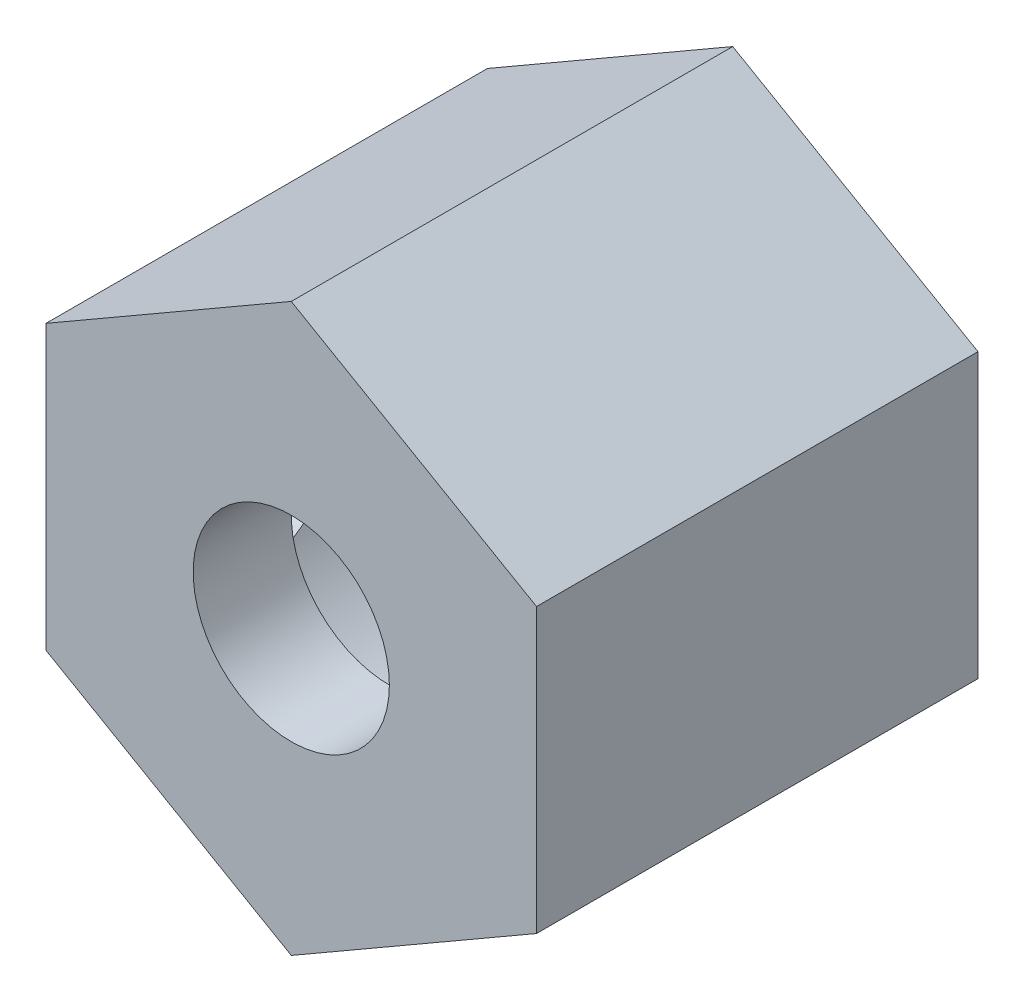
ISO-10303-21;
HEADER;
FILE_DESCRIPTION(('STEP AP214'),'2;1');
FILE_NAME('part.step','',(''),(''),'','','');
FILE_SCHEMA(('AUTOMOTIVE_DESIGN { 1 0 10303 214 1 1 1 1 }'));
ENDSEC;
DATA;
#1=APPLICATION_CONTEXT('core data for automotive mechanical design processes');
#2=APPLICATION_PROTOCOL_DEFINITION('international standard','automotive_design',2000,#1);
#3=PRODUCT_CONTEXT('',#1,'mechanical');
#4=PRODUCT('Part','Part','',(#3));
#5=PRODUCT_RELATED_PRODUCT_CATEGORY('part','',(#4));
#6=PRODUCT_DEFINITION_FORMATION('','',#4);
#7=PRODUCT_DEFINITION_CONTEXT('part definition',#1,'design');
#8=PRODUCT_DEFINITION('design','',#6,#7);
#9=PRODUCT_DEFINITION_SHAPE('','',#8);
#10=(LENGTH_UNIT() NAMED_UNIT(*) SI_UNIT(.MILLI.,.METRE.));
#11=(NAMED_UNIT(*) PLANE_ANGLE_UNIT() SI_UNIT($,.RADIAN.));
#12=(NAMED_UNIT(*) SI_UNIT($,.STERADIAN.) SOLID_ANGLE_UNIT());
#13=UNCERTAINTY_MEASURE_WITH_UNIT(LENGTH_MEASURE(1.E-05),#10,'distance_accuracy_value','');
#14=(GEOMETRIC_REPRESENTATION_CONTEXT(3) GLOBAL_UNCERTAINTY_ASSIGNED_CONTEXT((#13)) GLOBAL_UNIT_ASSIGNED_CONTEXT((#10,
#11,#12)) REPRESENTATION_CONTEXT('',''));
#15=CARTESIAN_POINT('',(0.,0.,0.));
#16=DIRECTION('',(0.,0.,1.));
#17=DIRECTION('',(1.,0.,0.));
#18=AXIS2_PLACEMENT_3D('',#15,#16,#17);
#19=CARTESIAN_POINT('',(-2.50000000000005,0.,3.));
#20=DIRECTION('',(-1.,0.,0.));
#21=DIRECTION('',(0.,-1.,0.));
#22=AXIS2_PLACEMENT_3D('',#19,#20,#21);
#23=CYLINDRICAL_SURFACE('',#22,2.);
#24=CARTESIAN_POINT('',(-5.00000000000005,0.,3.));
#25=DIRECTION('',(-1.,0.,0.));
#26=DIRECTION('',(0.,-1.,0.));
#27=AXIS2_PLACEMENT_3D('',#24,#25,#26);
#28=CIRCLE('',#27,2.);
#29=CARTESIAN_POINT('',(-5.00000000000004,-2.,3.));
#30=VERTEX_POINT('',#29);
#31=EDGE_CURVE('E151',#30,#30,#28,.T.);
#32=ORIENTED_EDGE('',*,*,#31,.T.);
#33=EDGE_LOOP('',(#32));
#34=FACE_BOUND('',#33,.T.);
#35=DIRECTION('',(-1.,0.,0.));
#36=VECTOR('',#35,1.);
#37=CARTESIAN_POINT('',(-2.50000000000004,-1.73205080756887,4.));
#38=LINE('',#37,#36);
#39=CARTESIAN_POINT('',(-3.60555127546399,-1.73205080756887,4.));
#40=VERTEX_POINT('',#39);
#41=CARTESIAN_POINT('',(-2.50000000000004,-1.73205080756887,4.));
#42=VERTEX_POINT('',#41);
#43=EDGE_CURVE('E52',#40,#42,#38,.F.);
#44=ORIENTED_EDGE('',*,*,#43,.F.);
#45=CARTESIAN_POINT('',(-3.60555127546399,-1.73205080756887,4.));
#46=CARTESIAN_POINT('',(-3.59335773083577,-1.75743230902973,3.95603155129199));
#47=CARTESIAN_POINT('',(-3.58161590106257,-1.78119011835499,3.91101906958533));
#48=CARTESIAN_POINT('',(-3.55933072898676,-1.82531528612257,3.81904415926797));
#49=CARTESIAN_POINT('',(-3.54878810006105,-1.84568062977622,3.77208059244373));
#50=CARTESIAN_POINT('',(-3.51939247400691,-1.9014891983726,3.62840036235276));
#51=CARTESIAN_POINT('',(-3.50281201050023,-1.93156409831937,3.52903353222039));
#52=CARTESIAN_POINT('',(-3.47788404640176,-1.97610562978235,3.3254355802151));
#53=CARTESIAN_POINT('',(-3.46956906123531,-1.99051063856038,3.22118692337027));
#54=CARTESIAN_POINT('',(-3.46254312750538,-2.00271118995501,3.01157803503726));
#55=CARTESIAN_POINT('',(-3.463812463324,-2.00054082915953,2.9062205304032));
#56=CARTESIAN_POINT('',(-3.47532822374668,-1.98045518830549,2.70427729512121));
#57=CARTESIAN_POINT('',(-3.48500626896966,-1.96353656877668,2.60755602101852));
#58=CARTESIAN_POINT('',(-3.51132581454488,-1.91606874112656,2.41845082669367));
#59=CARTESIAN_POINT('',(-3.52797433469303,-1.88550579006828,2.3260713836311));
#60=CARTESIAN_POINT('',(-3.56720328743763,-1.81022917644571,2.14371247191141));
#61=CARTESIAN_POINT('',(-3.59001176794506,-1.76495391159242,2.05401574390328));
#62=CARTESIAN_POINT('',(-3.63880991575374,-1.66201808479433,1.88300996107138));
#63=CARTESIAN_POINT('',(-3.66480056445339,-1.60435369781574,1.80170350817436));
#64=CARTESIAN_POINT('',(-3.72099315598682,-1.46975171664611,1.63899333114211));
#65=CARTESIAN_POINT('',(-3.75131198122848,-1.39129894569273,1.55887784657841));
#66=CARTESIAN_POINT('',(-3.80993651610921,-1.22165363069001,1.4125121033277));
#67=CARTESIAN_POINT('',(-3.8382413797941,-1.13045578025614,1.34626764866067));
#68=CARTESIAN_POINT('',(-3.89074557578438,-0.934191645630835,1.22776648443529));
#69=CARTESIAN_POINT('',(-3.91479355737993,-0.828787493978465,1.17599741106699));
#70=CARTESIAN_POINT('',(-3.95490294311376,-0.609224002358081,1.09142667044101));
#71=CARTESIAN_POINT('',(-3.97097132678599,-0.49507241478437,1.05860842331337));
#72=CARTESIAN_POINT('',(-3.99214119966798,-0.272357253213574,1.01568587548047));
#73=CARTESIAN_POINT('',(-3.99810114880291,-0.164218343326146,1.00379983097132));
#74=CARTESIAN_POINT('',(-4.00112101128663,0.052661872550485,0.997756076261019));
#75=CARTESIAN_POINT('',(-3.99818426210767,0.16140293737288,1.00359171801849));
#76=CARTESIAN_POINT('',(-3.98424622361234,0.368553846363491,1.03166383852384));
#77=CARTESIAN_POINT('',(-3.97381009481258,0.467161698393071,1.05275159129534));
#78=CARTESIAN_POINT('',(-3.94648990050123,0.659269829238947,1.10913011781207));
#79=CARTESIAN_POINT('',(-3.92960495980895,0.752769412832765,1.14442281937329));
#80=CARTESIAN_POINT('',(-3.89006951308626,0.936225897556058,1.22965510019087));
#81=CARTESIAN_POINT('',(-3.86721549992044,1.02589174059472,1.28012381956515));
#82=CARTESIAN_POINT('',(-3.8180887347611,1.19584155418368,1.39363187522344));
#83=CARTESIAN_POINT('',(-3.79181431858965,1.27612092146947,1.45667733865355));
#84=CARTESIAN_POINT('',(-3.73535548991952,1.43345046072824,1.6008194562662));
#85=CARTESIAN_POINT('',(-3.70504224528556,1.50938324404423,1.68308840974059));
#86=CARTESIAN_POINT('',(-3.64605657131005,1.64677679662256,1.85954433961172));
#87=CARTESIAN_POINT('',(-3.61738511689419,1.70822903316507,1.95373829286333));
#88=CARTESIAN_POINT('',(-3.56413772359533,1.81678651667512,2.15568513066313));
#89=CARTESIAN_POINT('',(-3.53973747173925,1.86332283641462,2.26379399238089));
#90=CARTESIAN_POINT('',(-3.50001425458915,1.93692656605362,2.48796540220153));
#91=CARTESIAN_POINT('',(-3.4846776975021,1.96402314065257,2.60401574824535));
#92=CARTESIAN_POINT('',(-3.46681150583112,1.99537106778987,2.82733698386759));
#93=CARTESIAN_POINT('',(-3.46308284335465,2.00176428213776,2.93421137951819));
#94=CARTESIAN_POINT('',(-3.46560248285916,1.99740058709233,3.14752200441211));
#95=CARTESIAN_POINT('',(-3.47185224683929,1.98664116456359,3.25395816715646));
#96=CARTESIAN_POINT('',(-3.49246144256936,1.95015218488998,3.45436884584777));
#97=CARTESIAN_POINT('',(-3.50612605040994,1.92570018763451,3.54865602169357));
#98=CARTESIAN_POINT('',(-3.53938098597231,1.86386847209117,3.7316444908932));
#99=CARTESIAN_POINT('',(-3.55896403176419,1.82650463222385,3.8203524876358));
#100=CARTESIAN_POINT('',(-3.58858809222151,1.76702031451678,3.93751616106464));
#101=CARTESIAN_POINT('',(-3.59695929917216,1.74993417443421,3.96903235730719));
#102=CARTESIAN_POINT('',(-3.60555127546399,1.73205080756889,4.));
#103=B_SPLINE_CURVE_WITH_KNOTS('',3,(#45,#46,#47,#48,#49,#50,#51,#52,#53,#54,#55,#56,#57,#58,
#59,#60,#61,#62,#63,#64,#65,#66,#67,#68,#69,#70,#71,#72,#73,#74,#75,#76,#77,#78,#79,#80,#81,#82,
#83,#84,#85,#86,#87,#88,#89,#90,#91,#92,#93,#94,#95,#96,#97,#98,#99,#100,#101,#102),
.UNSPECIFIED.,.F.,.F.,(4,2,2,2,2,2,2,2,2,2,2,2,2,2,2,2,2,2,2,2,2,2,2,2,2,2,2,2,4),(0.,
0.15656246582348,0.313217585278108,0.627020401982763,0.942052854014339,1.25643743909932,
1.55109201818126,1.84604405321478,2.15392615359509,2.46190344684671,2.80883171655222,
3.1559048617687,3.51355191736351,3.87088559553736,4.19598870348905,4.52096986864907,
4.82372976071051,5.12653075550896,5.44143696115875,5.75649695933711,6.10292671402422,
6.44956009618428,6.80816748136441,7.16623573022166,7.48582983457815,7.80547076888193,
8.09932817113884,8.39282547886194,8.50320278803289),.UNSPECIFIED.);
#104=CARTESIAN_POINT('',(-3.60555127546399,1.73205080756888,4.));
#105=VERTEX_POINT('',#104);
#106=EDGE_CURVE('E113',#40,#105,#103,.T.);
#107=ORIENTED_EDGE('',*,*,#106,.T.);
#108=DIRECTION('',(-1.,0.,0.));
#109=VECTOR('',#108,1.);
#110=CARTESIAN_POINT('',(-2.50000000000005,1.73205080756888,4.));
#111=LINE('',#110,#109);
#112=CARTESIAN_POINT('',(-2.50000000000005,1.73205080756888,4.));
#113=VERTEX_POINT('',#112);
#114=EDGE_CURVE('E101',#113,#105,#111,.T.);
#115=ORIENTED_EDGE('',*,*,#114,.F.);
#116=CARTESIAN_POINT('',(-2.50000000000005,0.,3.));
#117=DIRECTION('',(-1.,0.,0.));
#118=DIRECTION('',(0.,-1.,0.));
#119=AXIS2_PLACEMENT_3D('',#116,#117,#118);
#120=CIRCLE('',#119,2.);
#121=EDGE_CURVE('E149',#42,#113,#120,.T.);
#122=ORIENTED_EDGE('',*,*,#121,.F.);
#123=EDGE_LOOP('',(#44,#107,#115,#122));
#124=FACE_BOUND('',#123,.T.);
#125=ADVANCED_FACE('F36',(#34,#124),#23,.F.);
#126=CARTESIAN_POINT('',(-2.50000000000005,0.,3.));
#127=DIRECTION('',(-1.,0.,0.));
#128=DIRECTION('',(0.,-1.,0.));
#129=AXIS2_PLACEMENT_3D('',#126,#127,#128);
#130=PLANE('',#129);
#131=ORIENTED_EDGE('',*,*,#121,.T.);
#132=DIRECTION('',(0.,-1.,0.));
#133=VECTOR('',#132,1.);
#134=CARTESIAN_POINT('',(-2.50000000000005,0.,4.));
#135=LINE('',#134,#133);
#136=EDGE_CURVE('E105',#113,#42,#135,.T.);
#137=ORIENTED_EDGE('',*,*,#136,.T.);
#138=EDGE_LOOP('',(#131,#137));
#139=FACE_BOUND('',#138,.T.);
#140=ADVANCED_FACE('F141',(#139),#130,.T.);
#141=CARTESIAN_POINT('',(0.,0.,-0.00100000000000013));
#142=DIRECTION('',(0.,0.,1.));
#143=DIRECTION('',(1.,0.,0.));
#144=AXIS2_PLACEMENT_3D('',#141,#142,#143);
#145=CYLINDRICAL_SURFACE('',#144,2.);
#146=CARTESIAN_POINT('',(0.,0.,6.));
#147=DIRECTION('',(0.,0.,1.));
#148=DIRECTION('',(1.,0.,0.));
#149=AXIS2_PLACEMENT_3D('',#146,#147,#148);
#150=CIRCLE('',#149,2.);
#151=CARTESIAN_POINT('',(2.,0.,6.));
#152=VERTEX_POINT('',#151);
#153=EDGE_CURVE('E156',#152,#152,#150,.T.);
#154=CARTESIAN_POINT('',(0.,0.,4.));
#155=DIRECTION('',(0.,0.,-1.));
#156=DIRECTION('',(-1.,0.,0.));
#157=AXIS2_PLACEMENT_3D('',#154,#155,#156);
#158=CIRCLE('',#157,2.);
#159=CARTESIAN_POINT('',(2.,0.,4.));
#160=VERTEX_POINT('',#159);
#161=EDGE_CURVE('E40',#160,#160,#158,.F.);
#162=CARTESIAN_POINT('',(2.,0.,6.));
#163=CARTESIAN_POINT('',(2.,0.,5.97916666666667));
#164=CARTESIAN_POINT('',(2.,0.,5.95833333333333));
#165=CARTESIAN_POINT('',(2.,0.,5.91666666666667));
#166=CARTESIAN_POINT('',(2.,0.,5.89583333333333));
#167=CARTESIAN_POINT('',(2.,0.,5.85416666666667));
#168=CARTESIAN_POINT('',(2.,0.,5.83333333333333));
#169=CARTESIAN_POINT('',(2.,0.,5.79166666666667));
#170=CARTESIAN_POINT('',(2.,0.,5.77083333333333));
#171=CARTESIAN_POINT('',(2.,0.,5.72916666666667));
#172=CARTESIAN_POINT('',(2.,0.,5.70833333333333));
#173=CARTESIAN_POINT('',(2.,0.,5.66666666666667));
#174=CARTESIAN_POINT('',(2.,0.,5.64583333333333));
#175=CARTESIAN_POINT('',(2.,0.,5.60416666666667));
#176=CARTESIAN_POINT('',(2.,0.,5.58333333333333));
#177=CARTESIAN_POINT('',(2.,0.,5.54166666666667));
#178=CARTESIAN_POINT('',(2.,0.,5.52083333333333));
#179=CARTESIAN_POINT('',(2.,0.,5.47916666666667));
#180=CARTESIAN_POINT('',(2.,0.,5.45833333333333));
#181=CARTESIAN_POINT('',(2.,0.,5.41666666666667));
#182=CARTESIAN_POINT('',(2.,0.,5.39583333333333));
#183=CARTESIAN_POINT('',(2.,0.,5.35416666666667));
#184=CARTESIAN_POINT('',(2.,0.,5.33333333333333));
#185=CARTESIAN_POINT('',(2.,0.,5.29166666666667));
#186=CARTESIAN_POINT('',(2.,0.,5.27083333333333));
#187=CARTESIAN_POINT('',(2.,0.,5.22916666666667));
#188=CARTESIAN_POINT('',(2.,0.,5.20833333333333));
#189=CARTESIAN_POINT('',(2.,0.,5.16666666666667));
#190=CARTESIAN_POINT('',(2.,0.,5.14583333333333));
#191=CARTESIAN_POINT('',(2.,0.,5.10416666666667));
#192=CARTESIAN_POINT('',(2.,0.,5.08333333333333));
#193=CARTESIAN_POINT('',(2.,0.,5.04166666666667));
#194=CARTESIAN_POINT('',(2.,0.,5.02083333333333));
#195=CARTESIAN_POINT('',(2.,0.,4.97916666666667));
#196=CARTESIAN_POINT('',(2.,0.,4.95833333333333));
#197=CARTESIAN_POINT('',(2.,0.,4.91666666666667));
#198=CARTESIAN_POINT('',(2.,0.,4.89583333333333));
#199=CARTESIAN_POINT('',(2.,0.,4.85416666666667));
#200=CARTESIAN_POINT('',(2.,0.,4.83333333333333));
#201=CARTESIAN_POINT('',(2.,0.,4.79166666666667));
#202=CARTESIAN_POINT('',(2.,0.,4.77083333333333));
#203=CARTESIAN_POINT('',(2.,0.,4.72916666666667));
#204=CARTESIAN_POINT('',(2.,0.,4.70833333333333));
#205=CARTESIAN_POINT('',(2.,0.,4.66666666666667));
#206=CARTESIAN_POINT('',(2.,0.,4.64583333333333));
#207=CARTESIAN_POINT('',(2.,0.,4.60416666666667));
#208=CARTESIAN_POINT('',(2.,0.,4.58333333333333));
#209=CARTESIAN_POINT('',(2.,0.,4.54166666666667));
#210=CARTESIAN_POINT('',(2.,0.,4.52083333333333));
#211=CARTESIAN_POINT('',(2.,0.,4.47916666666667));
#212=CARTESIAN_POINT('',(2.,0.,4.45833333333333));
#213=CARTESIAN_POINT('',(2.,0.,4.41666666666667));
#214=CARTESIAN_POINT('',(2.,0.,4.39583333333333));
#215=CARTESIAN_POINT('',(2.,0.,4.35416666666667));
#216=CARTESIAN_POINT('',(2.,0.,4.33333333333333));
#217=CARTESIAN_POINT('',(2.,0.,4.29166666666667));
#218=CARTESIAN_POINT('',(2.,0.,4.27083333333333));
#219=CARTESIAN_POINT('',(2.,0.,4.22916666666667));
#220=CARTESIAN_POINT('',(2.,0.,4.20833333333333));
#221=CARTESIAN_POINT('',(2.,0.,4.16666666666667));
#222=CARTESIAN_POINT('',(2.,0.,4.14583333333333));
#223=CARTESIAN_POINT('',(2.,0.,4.10416666666667));
#224=CARTESIAN_POINT('',(2.,0.,4.08333333333333));
#225=CARTESIAN_POINT('',(2.,0.,4.04166666666667));
#226=CARTESIAN_POINT('',(2.,0.,4.02083333333333));
#227=CARTESIAN_POINT('',(2.,0.,4.));
#228=B_SPLINE_CURVE_WITH_KNOTS('',3,(#162,#163,#164,#165,#166,#167,#168,#169,#170,#171,#172,
#173,#174,#175,#176,#177,#178,#179,#180,#181,#182,#183,#184,#185,#186,#187,#188,#189,#190,#191,
#192,#193,#194,#195,#196,#197,#198,#199,#200,#201,#202,#203,#204,#205,#206,#207,#208,#209,#210,
#211,#212,#213,#214,#215,#216,#217,#218,#219,#220,#221,#222,#223,#224,#225,#226,#227),
.UNSPECIFIED.,.F.,.F.,(4,2,2,2,2,2,2,2,2,2,2,2,2,2,2,2,2,2,2,2,2,2,2,2,2,2,2,2,2,2,2,2,4),(0.,
0.0625000000000001,0.125,0.1875,0.25,0.3125,0.375,0.4375,0.5,0.5625,0.625,0.6875,0.75,0.8125,
0.875,0.9375,1.,1.0625,1.125,1.1875,1.25,1.3125,1.375,1.4375,1.5,1.5625,1.625,1.6875,1.75,
1.8125,1.875,1.9375,2.),.UNSPECIFIED.);
#229=EDGE_CURVE('BSEAM139',#152,#160,#228,.T.);
#230=ORIENTED_EDGE('',*,*,#153,.T.);
#231=ORIENTED_EDGE('',*,*,#161,.F.);
#232=ORIENTED_EDGE('',*,*,#229,.T.);
#233=ORIENTED_EDGE('',*,*,#229,.F.);
#234=EDGE_LOOP('',(#230,#232,#231,#233));
#235=FACE_BOUND('',#234,.T.);
#236=ADVANCED_FACE('F139',(#235),#145,.F.);
#237=CARTESIAN_POINT('',(-5.00000000000004,-2.88675134594815,6.));
#238=DIRECTION('',(0.5,0.866025403784439,0.));
#239=DIRECTION('',(-0.866025403784439,0.5,0.));
#240=AXIS2_PLACEMENT_3D('',#237,#238,#239);
#241=PLANE('',#240);
#242=DIRECTION('',(0.,0.,-1.));
#243=VECTOR('',#242,1.);
#244=CARTESIAN_POINT('',(-5.00000000000004,-2.88675134594815,6.));
#245=LINE('',#244,#243);
#246=CARTESIAN_POINT('',(-5.00000000000004,-2.88675134594815,6.));
#247=VERTEX_POINT('',#246);
#248=CARTESIAN_POINT('',(-5.00000000000008,-2.88675134594811,-3.));
#249=VERTEX_POINT('',#248);
#250=EDGE_CURVE('E169',#247,#249,#245,.T.);
#251=ORIENTED_EDGE('',*,*,#250,.T.);
#252=DIRECTION('',(-0.866025403784434,0.500000000000008,0.));
#253=VECTOR('',#252,1.);
#254=CARTESIAN_POINT('',(0.,-5.77350269189632,-3.));
#255=LINE('',#254,#253);
#256=CARTESIAN_POINT('',(0.,-5.77350269189632,-3.));
#257=VERTEX_POINT('',#256);
#258=EDGE_CURVE('E199',#257,#249,#255,.T.);
#259=ORIENTED_EDGE('',*,*,#258,.F.);
#260=DIRECTION('',(0.,0.,-1.));
#261=VECTOR('',#260,1.);
#262=CARTESIAN_POINT('',(0.,-5.77350269189631,6.));
#263=LINE('',#262,#261);
#264=CARTESIAN_POINT('',(0.,-5.77350269189631,6.));
#265=VERTEX_POINT('',#264);
#266=EDGE_CURVE('E11',#265,#257,#263,.T.);
#267=ORIENTED_EDGE('',*,*,#266,.F.);
#268=DIRECTION('',(0.866025403784439,-0.5,0.));
#269=VECTOR('',#268,1.);
#270=CARTESIAN_POINT('',(-5.00000000000004,-2.88675134594815,6.));
#271=LINE('',#270,#269);
#272=EDGE_CURVE('E150',#247,#265,#271,.T.);
#273=ORIENTED_EDGE('',*,*,#272,.F.);
#274=EDGE_LOOP('',(#251,#259,#267,#273));
#275=FACE_BOUND('',#274,.T.);
#276=ADVANCED_FACE('F38',(#275),#241,.F.);
#277=CARTESIAN_POINT('',(0.,-5.77350269189631,6.));
#278=DIRECTION('',(-0.5,0.866025403784439,0.));
#279=DIRECTION('',(-0.866025403784439,-0.5,0.));
#280=AXIS2_PLACEMENT_3D('',#277,#278,#279);
#281=PLANE('',#280);
#282=ORIENTED_EDGE('',*,*,#266,.T.);
#283=DIRECTION('',(-0.866025403784442,-0.499999999999994,0.));
#284=VECTOR('',#283,1.);
#285=CARTESIAN_POINT('',(5.00000000000004,-2.88675134594819,-3.));
#286=LINE('',#285,#284);
#287=CARTESIAN_POINT('',(5.00000000000004,-2.88675134594819,-3.));
#288=VERTEX_POINT('',#287);
#289=EDGE_CURVE('E192',#288,#257,#286,.T.);
#290=ORIENTED_EDGE('',*,*,#289,.F.);
#291=DIRECTION('',(0.,0.,-1.));
#292=VECTOR('',#291,1.);
#293=CARTESIAN_POINT('',(5.00000000000004,-2.88675134594816,6.));
#294=LINE('',#293,#292);
#295=CARTESIAN_POINT('',(5.00000000000004,-2.88675134594816,6.));
#296=VERTEX_POINT('',#295);
#297=EDGE_CURVE('E45',#296,#288,#294,.T.);
#298=ORIENTED_EDGE('',*,*,#297,.F.);
#299=DIRECTION('',(0.866025403784439,0.5,0.));
#300=VECTOR('',#299,1.);
#301=CARTESIAN_POINT('',(0.,-5.77350269189631,6.));
#302=LINE('',#301,#300);
#303=EDGE_CURVE('E153',#265,#296,#302,.T.);
#304=ORIENTED_EDGE('',*,*,#303,.F.);
#305=EDGE_LOOP('',(#282,#290,#298,#304));
#306=FACE_BOUND('',#305,.T.);
#307=ADVANCED_FACE('F197',(#306),#281,.F.);
#308=CARTESIAN_POINT('',(5.00000000000004,-2.88675134594816,6.));
#309=DIRECTION('',(-1.,0.,0.));
#310=DIRECTION('',(0.,0.,1.));
#311=AXIS2_PLACEMENT_3D('',#308,#309,#310);
#312=PLANE('',#311);
#313=ORIENTED_EDGE('',*,*,#297,.T.);
#314=DIRECTION('',(0.,-1.,0.));
#315=VECTOR('',#314,1.);
#316=CARTESIAN_POINT('',(5.00000000000006,2.88675134594814,-3.));
#317=LINE('',#316,#315);
#318=CARTESIAN_POINT('',(5.00000000000006,2.88675134594814,-3.));
#319=VERTEX_POINT('',#318);
#320=EDGE_CURVE('E184',#319,#288,#317,.T.);
#321=ORIENTED_EDGE('',*,*,#320,.F.);
#322=DIRECTION('',(0.,0.,-1.));
#323=VECTOR('',#322,1.);
#324=CARTESIAN_POINT('',(5.00000000000004,2.88675134594817,6.));
#325=LINE('',#324,#323);
#326=CARTESIAN_POINT('',(5.00000000000004,2.88675134594817,6.));
#327=VERTEX_POINT('',#326);
#328=EDGE_CURVE('E175',#327,#319,#325,.T.);
#329=ORIENTED_EDGE('',*,*,#328,.F.);
#330=DIRECTION('',(0.,1.,0.));
#331=VECTOR('',#330,1.);
#332=CARTESIAN_POINT('',(5.00000000000004,-2.88675134594816,6.));
#333=LINE('',#332,#331);
#334=EDGE_CURVE('E162',#296,#327,#333,.T.);
#335=ORIENTED_EDGE('',*,*,#334,.F.);
#336=EDGE_LOOP('',(#313,#321,#329,#335));
#337=FACE_BOUND('',#336,.T.);
#338=ADVANCED_FACE('F182',(#337),#312,.F.);
#339=CARTESIAN_POINT('',(5.00000000000004,2.88675134594817,6.));
#340=DIRECTION('',(-0.5,-0.866025403784439,0.));
#341=DIRECTION('',(0.866025403784439,-0.5,0.));
#342=AXIS2_PLACEMENT_3D('',#339,#340,#341);
#343=PLANE('',#342);
#344=ORIENTED_EDGE('',*,*,#328,.T.);
#345=DIRECTION('',(0.866025403784437,-0.500000000000002,0.));
#346=VECTOR('',#345,1.);
#347=CARTESIAN_POINT('',(0.,5.77350269189632,-3.));
#348=LINE('',#347,#346);
#349=CARTESIAN_POINT('',(0.,5.77350269189632,-3.));
#350=VERTEX_POINT('',#349);
#351=EDGE_CURVE('E195',#350,#319,#348,.T.);
#352=ORIENTED_EDGE('',*,*,#351,.F.);
#353=DIRECTION('',(0.,0.,-1.));
#354=VECTOR('',#353,1.);
#355=CARTESIAN_POINT('',(0.,5.77350269189632,6.));
#356=LINE('',#355,#354);
#357=CARTESIAN_POINT('',(0.,5.77350269189632,6.));
#358=VERTEX_POINT('',#357);
#359=EDGE_CURVE('E173',#358,#350,#356,.T.);
#360=ORIENTED_EDGE('',*,*,#359,.F.);
#361=DIRECTION('',(-0.866025403784439,0.5,0.));
#362=VECTOR('',#361,1.);
#363=CARTESIAN_POINT('',(5.00000000000004,2.88675134594817,6.));
#364=LINE('',#363,#362);
#365=EDGE_CURVE('E164',#327,#358,#364,.T.);
#366=ORIENTED_EDGE('',*,*,#365,.F.);
#367=EDGE_LOOP('',(#344,#352,#360,#366));
#368=FACE_BOUND('',#367,.T.);
#369=ADVANCED_FACE('F226',(#368),#343,.F.);
#370=CARTESIAN_POINT('',(0.,5.77350269189632,6.));
#371=DIRECTION('',(0.5,-0.866025403784438,0.));
#372=DIRECTION('',(0.866025403784439,0.5,0.));
#373=AXIS2_PLACEMENT_3D('',#370,#371,#372);
#374=PLANE('',#373);
#375=ORIENTED_EDGE('',*,*,#359,.T.);
#376=DIRECTION('',(0.866025403784442,0.499999999999994,0.));
#377=VECTOR('',#376,1.);
#378=CARTESIAN_POINT('',(-5.00000000000002,2.88675134594822,-3.));
#379=LINE('',#378,#377);
#380=CARTESIAN_POINT('',(-5.00000000000002,2.88675134594822,-3.));
#381=VERTEX_POINT('',#380);
#382=EDGE_CURVE('E220',#381,#350,#379,.T.);
#383=ORIENTED_EDGE('',*,*,#382,.F.);
#384=DIRECTION('',(0.,0.,-1.));
#385=VECTOR('',#384,1.);
#386=CARTESIAN_POINT('',(-5.00000000000005,2.88675134594816,6.));
#387=LINE('',#386,#385);
#388=CARTESIAN_POINT('',(-5.00000000000005,2.88675134594816,6.));
#389=VERTEX_POINT('',#388);
#390=EDGE_CURVE('E171',#389,#381,#387,.T.);
#391=ORIENTED_EDGE('',*,*,#390,.F.);
#392=DIRECTION('',(-0.866025403784439,-0.5,0.));
#393=VECTOR('',#392,1.);
#394=CARTESIAN_POINT('',(0.,5.77350269189632,6.));
#395=LINE('',#394,#393);
#396=EDGE_CURVE('E166',#358,#389,#395,.T.);
#397=ORIENTED_EDGE('',*,*,#396,.F.);
#398=EDGE_LOOP('',(#375,#383,#391,#397));
#399=FACE_BOUND('',#398,.T.);
#400=ADVANCED_FACE('F219',(#399),#374,.F.);
#401=CARTESIAN_POINT('',(-5.00000000000005,2.88675134594816,6.));
#402=DIRECTION('',(1.,0.,0.));
#403=DIRECTION('',(0.,1.,0.));
#404=AXIS2_PLACEMENT_3D('',#401,#402,#403);
#405=PLANE('',#404);
#406=ORIENTED_EDGE('',*,*,#31,.F.);
#407=EDGE_LOOP('',(#406));
#408=FACE_BOUND('',#407,.T.);
#409=ORIENTED_EDGE('',*,*,#390,.T.);
#410=DIRECTION('',(0.,1.,0.));
#411=VECTOR('',#410,1.);
#412=CARTESIAN_POINT('',(-5.00000000000008,-2.88675134594811,-3.));
#413=LINE('',#412,#411);
#414=EDGE_CURVE('E201',#249,#381,#413,.T.);
#415=ORIENTED_EDGE('',*,*,#414,.F.);
#416=ORIENTED_EDGE('',*,*,#250,.F.);
#417=DIRECTION('',(0.,-1.,0.));
#418=VECTOR('',#417,1.);
#419=CARTESIAN_POINT('',(-5.00000000000005,2.88675134594816,6.));
#420=LINE('',#419,#418);
#421=EDGE_CURVE('E60',#389,#247,#420,.T.);
#422=ORIENTED_EDGE('',*,*,#421,.F.);
#423=EDGE_LOOP('',(#409,#415,#416,#422));
#424=FACE_BOUND('',#423,.T.);
#425=ADVANCED_FACE('F212',(#408,#424),#405,.F.);
#426=CARTESIAN_POINT('',(0.,0.,6.));
#427=DIRECTION('',(0.,0.,1.));
#428=DIRECTION('',(1.,0.,0.));
#429=AXIS2_PLACEMENT_3D('',#426,#427,#428);
#430=PLANE('',#429);
#431=ORIENTED_EDGE('',*,*,#153,.F.);
#432=EDGE_LOOP('',(#431));
#433=FACE_BOUND('',#432,.T.);
#434=ORIENTED_EDGE('',*,*,#272,.T.);
#435=ORIENTED_EDGE('',*,*,#303,.T.);
#436=ORIENTED_EDGE('',*,*,#334,.T.);
#437=ORIENTED_EDGE('',*,*,#365,.T.);
#438=ORIENTED_EDGE('',*,*,#396,.T.);
#439=ORIENTED_EDGE('',*,*,#421,.T.);
#440=EDGE_LOOP('',(#434,#435,#436,#437,#438,#439));
#441=FACE_BOUND('',#440,.T.);
#442=ADVANCED_FACE('F137',(#433,#441),#430,.T.);
#443=CARTESIAN_POINT('',(0.,0.,-3.));
#444=DIRECTION('',(0.,0.,-1.));
#445=DIRECTION('',(-1.,0.,0.));
#446=AXIS2_PLACEMENT_3D('',#443,#444,#445);
#447=PLANE('',#446);
#448=CARTESIAN_POINT('',(0.,0.,-3.));
#449=DIRECTION('',(0.,0.,-1.));
#450=DIRECTION('',(-1.,0.,0.));
#451=AXIS2_PLACEMENT_3D('',#448,#449,#450);
#452=CIRCLE('',#451,4.);
#453=CARTESIAN_POINT('',(-4.,0.,-3.));
#454=VERTEX_POINT('',#453);
#455=EDGE_CURVE('E114',#454,#454,#452,.T.);
#456=ORIENTED_EDGE('',*,*,#455,.F.);
#457=EDGE_LOOP('',(#456));
#458=FACE_BOUND('',#457,.T.);
#459=ORIENTED_EDGE('',*,*,#382,.T.);
#460=ORIENTED_EDGE('',*,*,#351,.T.);
#461=ORIENTED_EDGE('',*,*,#320,.T.);
#462=ORIENTED_EDGE('',*,*,#289,.T.);
#463=ORIENTED_EDGE('',*,*,#258,.T.);
#464=ORIENTED_EDGE('',*,*,#414,.T.);
#465=EDGE_LOOP('',(#459,#460,#461,#462,#463,#464));
#466=FACE_BOUND('',#465,.T.);
#467=ADVANCED_FACE('F134',(#458,#466),#447,.T.);
#468=CARTESIAN_POINT('',(0.,0.,4.));
#469=DIRECTION('',(0.,0.,-1.));
#470=DIRECTION('',(-1.,0.,0.));
#471=AXIS2_PLACEMENT_3D('',#468,#469,#470);
#472=PLANE('',#471);
#473=ORIENTED_EDGE('',*,*,#161,.T.);
#474=EDGE_LOOP('',(#473));
#475=FACE_BOUND('',#474,.T.);
#476=ORIENTED_EDGE('',*,*,#43,.T.);
#477=ORIENTED_EDGE('',*,*,#136,.F.);
#478=ORIENTED_EDGE('',*,*,#114,.T.);
#479=CARTESIAN_POINT('',(0.,0.,4.));
#480=DIRECTION('',(0.,0.,-1.));
#481=DIRECTION('',(-1.,0.,0.));
#482=AXIS2_PLACEMENT_3D('',#479,#480,#481);
#483=CIRCLE('',#482,4.);
#484=EDGE_CURVE('E104',#105,#40,#483,.T.);
#485=ORIENTED_EDGE('',*,*,#484,.T.);
#486=EDGE_LOOP('',(#476,#477,#478,#485));
#487=FACE_BOUND('',#486,.T.);
#488=ADVANCED_FACE('F103',(#475,#487),#472,.T.);
#489=CARTESIAN_POINT('',(0.,0.,4.));
#490=DIRECTION('',(0.,0.,-1.));
#491=DIRECTION('',(-1.,0.,0.));
#492=AXIS2_PLACEMENT_3D('',#489,#490,#491);
#493=CYLINDRICAL_SURFACE('',#492,4.);
#494=ORIENTED_EDGE('',*,*,#455,.T.);
#495=EDGE_LOOP('',(#494));
#496=FACE_BOUND('',#495,.T.);
#497=ORIENTED_EDGE('',*,*,#484,.F.);
#498=ORIENTED_EDGE('',*,*,#106,.F.);
#499=EDGE_LOOP('',(#497,#498));
#500=FACE_BOUND('',#499,.T.);
#501=ADVANCED_FACE('F112',(#496,#500),#493,.F.);
#502=CLOSED_SHELL('',(#125,#140,#236,#276,#307,#338,#369,#400,#425,#442,#467,#488,#501));
#503=MANIFOLD_SOLID_BREP('B2',#502);
#504=ADVANCED_BREP_SHAPE_REPRESENTATION('',(#18,#503),#14);
#505=SHAPE_DEFINITION_REPRESENTATION(#9,#504);
ENDSEC;
END-ISO-10303-21;
